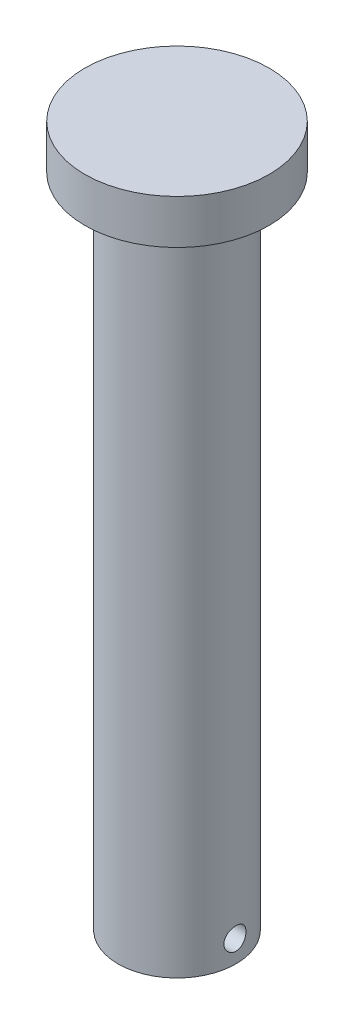
ISO-10303-21;
HEADER;
FILE_DESCRIPTION(('STEP AP214'),'2;1');
FILE_NAME('part.step','',(''),(''),'','','');
FILE_SCHEMA(('AUTOMOTIVE_DESIGN { 1 0 10303 214 1 1 1 1 }'));
ENDSEC;
DATA;
#1=APPLICATION_CONTEXT('core data for automotive mechanical design processes');
#2=APPLICATION_PROTOCOL_DEFINITION('international standard','automotive_design',2000,#1);
#3=PRODUCT_CONTEXT('',#1,'mechanical');
#4=PRODUCT('Part','Part','',(#3));
#5=PRODUCT_RELATED_PRODUCT_CATEGORY('part','',(#4));
#6=PRODUCT_DEFINITION_FORMATION('','',#4);
#7=PRODUCT_DEFINITION_CONTEXT('part definition',#1,'design');
#8=PRODUCT_DEFINITION('design','',#6,#7);
#9=PRODUCT_DEFINITION_SHAPE('','',#8);
#10=(LENGTH_UNIT() NAMED_UNIT(*) SI_UNIT(.MILLI.,.METRE.));
#11=(NAMED_UNIT(*) PLANE_ANGLE_UNIT() SI_UNIT($,.RADIAN.));
#12=(NAMED_UNIT(*) SI_UNIT($,.STERADIAN.) SOLID_ANGLE_UNIT());
#13=UNCERTAINTY_MEASURE_WITH_UNIT(LENGTH_MEASURE(1.E-05),#10,'distance_accuracy_value','');
#14=(GEOMETRIC_REPRESENTATION_CONTEXT(3) GLOBAL_UNCERTAINTY_ASSIGNED_CONTEXT((#13)) GLOBAL_UNIT_ASSIGNED_CONTEXT((#10,
#11,#12)) REPRESENTATION_CONTEXT('',''));
#15=CARTESIAN_POINT('',(0.,0.,0.));
#16=DIRECTION('',(0.,0.,1.));
#17=DIRECTION('',(1.,0.,0.));
#18=AXIS2_PLACEMENT_3D('',#15,#16,#17);
#19=CARTESIAN_POINT('',(0.,178.,0.));
#20=DIRECTION('',(0.,-1.,0.));
#21=DIRECTION('',(0.,0.,-1.));
#22=AXIS2_PLACEMENT_3D('',#19,#20,#21);
#23=CYLINDRICAL_SURFACE('',#22,16.);
#24=CARTESIAN_POINT('',(0.,178.,0.));
#25=DIRECTION('',(0.,1.,0.));
#26=DIRECTION('',(0.,0.,1.));
#27=AXIS2_PLACEMENT_3D('',#24,#25,#26);
#28=CIRCLE('',#27,16.);
#29=CARTESIAN_POINT('',(0.,178.,16.));
#30=VERTEX_POINT('',#29);
#31=EDGE_CURVE('E10',#30,#30,#28,.T.);
#32=ORIENTED_EDGE('',*,*,#31,.F.);
#33=EDGE_LOOP('',(#32));
#34=FACE_BOUND('',#33,.T.);
#35=CARTESIAN_POINT('',(0.,0.,0.));
#36=DIRECTION('',(0.,1.,0.));
#37=DIRECTION('',(0.,0.,1.));
#38=AXIS2_PLACEMENT_3D('',#35,#36,#37);
#39=CIRCLE('',#38,16.);
#40=CARTESIAN_POINT('',(0.,0.,16.));
#41=VERTEX_POINT('',#40);
#42=EDGE_CURVE('E49',#41,#41,#39,.T.);
#43=ORIENTED_EDGE('',*,*,#42,.T.);
#44=EDGE_LOOP('',(#43));
#45=FACE_BOUND('',#44,.T.);
#46=CARTESIAN_POINT('',(-15.7162336455017,6.00000000000001,2.99999999999998));
#47=CARTESIAN_POINT('',(-15.7162368759014,6.16691441602525,2.99999359766586));
#48=CARTESIAN_POINT('',(-15.7189215952138,6.33391189643726,2.98602252697895));
#49=CARTESIAN_POINT('',(-15.7293570202788,6.66319792316335,2.93054506503582));
#50=CARTESIAN_POINT('',(-15.7371120234618,6.82548235285483,2.88901531536944));
#51=CARTESIAN_POINT('',(-15.7567795293,7.14053014274188,2.7797407123558));
#52=CARTESIAN_POINT('',(-15.7686881581205,7.29330221861462,2.71202027908747));
#53=CARTESIAN_POINT('',(-15.7953165264186,7.58530711857359,2.55235131520727));
#54=CARTESIAN_POINT('',(-15.8100360465123,7.7245409980066,2.46040467518384));
#55=CARTESIAN_POINT('',(-15.8408322967791,7.98726039839828,2.25367357885243));
#56=CARTESIAN_POINT('',(-15.8569223325136,8.11055296694347,2.13864585866181));
#57=CARTESIAN_POINT('',(-15.8885291532806,8.33620877919913,1.88954355760708));
#58=CARTESIAN_POINT('',(-15.904045900623,8.43857064884959,1.75546772724986));
#59=CARTESIAN_POINT('',(-15.9329003565681,8.62019875320104,1.4708077891403));
#60=CARTESIAN_POINT('',(-15.9462205610473,8.69928306703885,1.32010568006771));
#61=CARTESIAN_POINT('',(-15.9690321726586,8.83093908454707,1.0072625665015));
#62=CARTESIAN_POINT('',(-15.9785238945667,8.88351296798045,0.845122503718987));
#63=CARTESIAN_POINT('',(-15.9925151024756,8.96005909722227,0.516005492374808));
#64=CARTESIAN_POINT('',(-15.9970713195265,8.98435661184538,0.34910664648969));
#65=CARTESIAN_POINT('',(-16.0008736923119,9.00467377540081,0.0135433520707431));
#66=CARTESIAN_POINT('',(-16.0001203002139,9.00069583227812,-0.155120944895363));
#67=CARTESIAN_POINT('',(-15.9934326752648,8.9648244577057,-0.487196715798817));
#68=CARTESIAN_POINT('',(-15.9875634449443,8.93328126113998,-0.650647520902962));
#69=CARTESIAN_POINT('',(-15.9713765266712,8.84372870120953,-0.969894331430974));
#70=CARTESIAN_POINT('',(-15.9610586765993,8.7857183733084,-1.1256900576531));
#71=CARTESIAN_POINT('',(-15.9370252059468,8.6445445378834,-1.42622013150307));
#72=CARTESIAN_POINT('',(-15.9232907518165,8.56124102417501,-1.57088714367709));
#73=CARTESIAN_POINT('',(-15.893942950857,8.3719486618457,-1.8443199544293));
#74=CARTESIAN_POINT('',(-15.8783294130233,8.26595750622484,-1.97308413382159));
#75=CARTESIAN_POINT('',(-15.8466702736113,8.03236859403294,-2.2131312379381));
#76=CARTESIAN_POINT('',(-15.8306217180324,7.90446443219586,-2.32411581514085));
#77=CARTESIAN_POINT('',(-15.8001301784924,7.63170093744275,-2.52310343702523));
#78=CARTESIAN_POINT('',(-15.785687218027,7.48684135647073,-2.61110614542366));
#79=CARTESIAN_POINT('',(-15.7600378661424,7.18388345859468,-2.76171704448957));
#80=CARTESIAN_POINT('',(-15.7488370106052,7.02576308561872,-2.82428187290845));
#81=CARTESIAN_POINT('',(-15.7310248479338,6.7009976317536,-2.92187313950114));
#82=CARTESIAN_POINT('',(-15.7244130207724,6.53435351907044,-2.95690269802218));
#83=CARTESIAN_POINT('',(-15.7166304060201,6.19996134228825,-2.9979934529948));
#84=CARTESIAN_POINT('',(-15.7153791163227,6.03226776886897,-3.0044832857172));
#85=CARTESIAN_POINT('',(-15.7182438284168,5.69819308982571,-2.98945937763451));
#86=CARTESIAN_POINT('',(-15.7223595647722,5.53181191970384,-2.96794702172868));
#87=CARTESIAN_POINT('',(-15.7354196012641,5.20649419389123,-2.89789736391767));
#88=CARTESIAN_POINT('',(-15.7443237338176,5.04750749475021,-2.84958477167981));
#89=CARTESIAN_POINT('',(-15.7659226831324,4.73988562053969,-2.72754448758122));
#90=CARTESIAN_POINT('',(-15.7786177792656,4.59125120936934,-2.65381492257592));
#91=CARTESIAN_POINT('',(-15.8065515572737,4.30666476191367,-2.48204706239322));
#92=CARTESIAN_POINT('',(-15.8218179085063,4.17087892426786,-2.38373799279244));
#93=CARTESIAN_POINT('',(-15.853096227362,3.91757591957134,-2.16596688688495));
#94=CARTESIAN_POINT('',(-15.8691082619299,3.80006039688846,-2.04650294866169));
#95=CARTESIAN_POINT('',(-15.9003324801189,3.58503247293175,-1.78789883574079));
#96=CARTESIAN_POINT('',(-15.9155311166661,3.48780834678807,-1.6485170681918));
#97=CARTESIAN_POINT('',(-15.943188096207,3.31815758764468,-1.3551490460803));
#98=CARTESIAN_POINT('',(-15.9556465446945,3.24572999995,-1.20116335407708));
#99=CARTESIAN_POINT('',(-15.9763611599169,3.12815980427184,-0.88375508315739));
#100=CARTESIAN_POINT('',(-15.9846390946028,3.08287562487718,-0.720386426157998));
#101=CARTESIAN_POINT('',(-15.9961528416749,3.02042590342024,-0.38819245476316));
#102=CARTESIAN_POINT('',(-15.9993891845988,3.0032574026746,-0.219367716431717));
#103=CARTESIAN_POINT('',(-16.0004445503087,2.99762939696311,0.116181520500992));
#104=CARTESIAN_POINT('',(-15.9983457325,3.00873449374091,0.282898614132494));
#105=CARTESIAN_POINT('',(-15.9891373322347,3.05838485553692,0.612046738558401));
#106=CARTESIAN_POINT('',(-15.9820277978158,3.09692985748858,0.774477810427441));
#107=CARTESIAN_POINT('',(-15.9635967595586,3.20018241476728,1.09021295119087));
#108=CARTESIAN_POINT('',(-15.9522827196229,3.26484362576144,1.24353263863612));
#109=CARTESIAN_POINT('',(-15.9266674413841,3.41844090731095,1.53721126263368));
#110=CARTESIAN_POINT('',(-15.912366002962,3.50737860421547,1.67756933000767));
#111=CARTESIAN_POINT('',(-15.882095597166,3.70850290888246,1.94351005555882));
#112=CARTESIAN_POINT('',(-15.8661056917023,3.82100406771521,2.06885247077665));
#113=CARTESIAN_POINT('',(-15.8343926708998,4.06540912499363,2.29903072131407));
#114=CARTESIAN_POINT('',(-15.8186696191953,4.19731758077809,2.40386172651198));
#115=CARTESIAN_POINT('',(-15.7891115480538,4.47825290938014,2.59095267889403));
#116=CARTESIAN_POINT('',(-15.7752953438736,4.6274268792286,2.67299481058045));
#117=CARTESIAN_POINT('',(-15.7513416912985,4.9376515798521,2.81072264841149));
#118=CARTESIAN_POINT('',(-15.7412007725928,5.09869093315073,2.8664332327646));
#119=CARTESIAN_POINT('',(-15.7278603261272,5.38350457614774,2.93859453193227));
#120=CARTESIAN_POINT('',(-15.7235262144357,5.5056114475282,2.96158211479936));
#121=CARTESIAN_POINT('',(-15.7177117118331,5.75179693683634,2.9922870215219));
#122=CARTESIAN_POINT('',(-15.7162312432422,5.87587550099935,3.00000476104179));
#123=CARTESIAN_POINT('',(-15.7162336455017,6.00000000000001,2.99999999999998));
#124=B_SPLINE_CURVE_WITH_KNOTS('',3,(#46,#47,#48,#49,#50,#51,#52,#53,#54,#55,#56,#57,#58,#59,
#60,#61,#62,#63,#64,#65,#66,#67,#68,#69,#70,#71,#72,#73,#74,#75,#76,#77,#78,#79,#80,#81,#82,#83,
#84,#85,#86,#87,#88,#89,#90,#91,#92,#93,#94,#95,#96,#97,#98,#99,#100,#101,#102,#103,#104,#105,
#106,#107,#108,#109,#110,#111,#112,#113,#114,#115,#116,#117,#118,#119,#120,#121,#122,#123),
.UNSPECIFIED.,.T.,.F.,(4,2,2,2,2,2,2,2,2,2,2,2,2,2,2,2,2,2,2,2,2,2,2,2,2,2,2,2,2,2,2,2,2,2,2,2,
2,2,4),(0.,0.500289011586374,1.00100260476079,1.50125045595686,2.00145927987816,
2.50724671397382,3.0130673413863,3.52274208696095,4.03237491879281,4.53608550920522,
5.03975320401296,5.53711301197449,6.03449094656849,6.53467383968438,7.03490761823571,
7.54281229528129,8.050724403848,8.55949872236533,9.06821537732975,9.5692649717415,
10.0702897867744,10.5671758463074,11.0640985324863,11.5667572530829,12.0694611878935,
12.5788825099174,13.0882842164341,13.5950053883737,14.1016732333466,14.6005860114028,
15.0994940064433,15.5975205306072,16.0955804271422,16.6007692801749,17.1060769546153,
17.6160600363781,18.1255603150176,18.4976061505795,18.8696418584437),.UNSPECIFIED.);
#125=CARTESIAN_POINT('',(-15.7162336455017,6.00000000000001,2.99999999999998));
#126=VERTEX_POINT('',#125);
#127=EDGE_CURVE('E59',#126,#126,#124,.T.);
#128=ORIENTED_EDGE('',*,*,#127,.F.);
#129=EDGE_LOOP('',(#128));
#130=FACE_BOUND('',#129,.T.);
#131=CARTESIAN_POINT('',(15.7162336455017,6.00000000000001,2.99999999999998));
#132=CARTESIAN_POINT('',(15.7162368759014,5.83308558397476,2.99999359766586));
#133=CARTESIAN_POINT('',(15.7189215952138,5.66608810356275,2.98602252697895));
#134=CARTESIAN_POINT('',(15.7293570202788,5.33680207683666,2.93054506503582));
#135=CARTESIAN_POINT('',(15.7371120234618,5.17451764714518,2.88901531536944));
#136=CARTESIAN_POINT('',(15.7567795293,4.85946985725813,2.7797407123558));
#137=CARTESIAN_POINT('',(15.7686881581205,4.70669778138539,2.71202027908747));
#138=CARTESIAN_POINT('',(15.7953165264186,4.41469288142641,2.55235131520727));
#139=CARTESIAN_POINT('',(15.8100360465123,4.27545900199341,2.46040467518384));
#140=CARTESIAN_POINT('',(15.8408322967791,4.01273960160173,2.25367357885243));
#141=CARTESIAN_POINT('',(15.8569223325136,3.88944703305654,2.13864585866181));
#142=CARTESIAN_POINT('',(15.8885291532806,3.66379122080088,1.88954355760708));
#143=CARTESIAN_POINT('',(15.904045900623,3.56142935115042,1.75546772724986));
#144=CARTESIAN_POINT('',(15.9329003565681,3.37980124679897,1.4708077891403));
#145=CARTESIAN_POINT('',(15.9462205610473,3.30071693296116,1.32010568006771));
#146=CARTESIAN_POINT('',(15.9690321726586,3.16906091545294,1.0072625665015));
#147=CARTESIAN_POINT('',(15.9785238945667,3.11648703201957,0.845122503718987));
#148=CARTESIAN_POINT('',(15.9925151024756,3.03994090277774,0.516005492374807));
#149=CARTESIAN_POINT('',(15.9970713195265,3.01564338815464,0.34910664648969));
#150=CARTESIAN_POINT('',(16.0008736923119,2.9953262245992,0.0135433520707419));
#151=CARTESIAN_POINT('',(16.0001203002139,2.99930416772189,-0.155120944895364));
#152=CARTESIAN_POINT('',(15.9934326752648,3.03517554229431,-0.487196715798817));
#153=CARTESIAN_POINT('',(15.9875634449443,3.06671873886003,-0.650647520902962));
#154=CARTESIAN_POINT('',(15.9713765266712,3.15627129879048,-0.969894331430974));
#155=CARTESIAN_POINT('',(15.9610586765993,3.21428162669161,-1.1256900576531));
#156=CARTESIAN_POINT('',(15.9370252059468,3.35545546211661,-1.42622013150307));
#157=CARTESIAN_POINT('',(15.9232907518165,3.438758975825,-1.57088714367709));
#158=CARTESIAN_POINT('',(15.893942950857,3.62805133815431,-1.8443199544293));
#159=CARTESIAN_POINT('',(15.8783294130233,3.73404249377517,-1.97308413382159));
#160=CARTESIAN_POINT('',(15.8466702736113,3.96763140596707,-2.2131312379381));
#161=CARTESIAN_POINT('',(15.8306217180324,4.09553556780415,-2.32411581514085));
#162=CARTESIAN_POINT('',(15.8001301784924,4.36829906255726,-2.52310343702523));
#163=CARTESIAN_POINT('',(15.785687218027,4.51315864352928,-2.61110614542367));
#164=CARTESIAN_POINT('',(15.7600378661424,4.81611654140533,-2.76171704448957));
#165=CARTESIAN_POINT('',(15.7488370106052,4.97423691438129,-2.82428187290845));
#166=CARTESIAN_POINT('',(15.7310248479338,5.29900236824641,-2.92187313950114));
#167=CARTESIAN_POINT('',(15.7244130207724,5.46564648092957,-2.95690269802218));
#168=CARTESIAN_POINT('',(15.7166304060201,5.80003865771176,-2.9979934529948));
#169=CARTESIAN_POINT('',(15.7153791163227,5.96773223113104,-3.0044832857172));
#170=CARTESIAN_POINT('',(15.7182438284168,6.3018069101743,-2.98945937763451));
#171=CARTESIAN_POINT('',(15.7223595647722,6.46818808029617,-2.96794702172868));
#172=CARTESIAN_POINT('',(15.7354196012641,6.79350580610878,-2.89789736391767));
#173=CARTESIAN_POINT('',(15.7443237338176,6.9524925052498,-2.84958477167981));
#174=CARTESIAN_POINT('',(15.7659226831324,7.26011437946032,-2.72754448758122));
#175=CARTESIAN_POINT('',(15.7786177792656,7.40874879063067,-2.65381492257592));
#176=CARTESIAN_POINT('',(15.8065515572737,7.69333523808634,-2.48204706239322));
#177=CARTESIAN_POINT('',(15.8218179085063,7.82912107573215,-2.38373799279244));
#178=CARTESIAN_POINT('',(15.853096227362,8.08242408042867,-2.16596688688496));
#179=CARTESIAN_POINT('',(15.8691082619299,8.19993960311155,-2.0465029486617));
#180=CARTESIAN_POINT('',(15.9003324801189,8.41496752706826,-1.78789883574079));
#181=CARTESIAN_POINT('',(15.9155311166661,8.51219165321194,-1.6485170681918));
#182=CARTESIAN_POINT('',(15.943188096207,8.68184241235533,-1.3551490460803));
#183=CARTESIAN_POINT('',(15.9556465446945,8.75427000005002,-1.20116335407708));
#184=CARTESIAN_POINT('',(15.9763611599169,8.87184019572817,-0.883755083157391));
#185=CARTESIAN_POINT('',(15.9846390946028,8.91712437512283,-0.720386426157999));
#186=CARTESIAN_POINT('',(15.9961528416749,8.97957409657977,-0.388192454763162));
#187=CARTESIAN_POINT('',(15.9993891845988,8.99674259732541,-0.219367716431718));
#188=CARTESIAN_POINT('',(16.0004445503087,9.0023706030369,0.11618152050099));
#189=CARTESIAN_POINT('',(15.9983457325,8.9912655062591,0.282898614132493));
#190=CARTESIAN_POINT('',(15.9891373322347,8.94161514446309,0.6120467385584));
#191=CARTESIAN_POINT('',(15.9820277978158,8.90307014251143,0.77447781042744));
#192=CARTESIAN_POINT('',(15.9635967595586,8.79981758523273,1.09021295119086));
#193=CARTESIAN_POINT('',(15.9522827196229,8.73515637423857,1.24353263863612));
#194=CARTESIAN_POINT('',(15.9266674413841,8.58155909268906,1.53721126263368));
#195=CARTESIAN_POINT('',(15.912366002962,8.49262139578454,1.67756933000767));
#196=CARTESIAN_POINT('',(15.882095597166,8.29149709111755,1.94351005555882));
#197=CARTESIAN_POINT('',(15.8661056917023,8.1789959322848,2.06885247077665));
#198=CARTESIAN_POINT('',(15.8343926708998,7.93459087500638,2.29903072131407));
#199=CARTESIAN_POINT('',(15.8186696191953,7.80268241922192,2.40386172651198));
#200=CARTESIAN_POINT('',(15.7891115480538,7.52174709061987,2.59095267889403));
#201=CARTESIAN_POINT('',(15.7752953438736,7.37257312077141,2.67299481058045));
#202=CARTESIAN_POINT('',(15.7513416912985,7.06234842014791,2.81072264841149));
#203=CARTESIAN_POINT('',(15.7412007725928,6.90130906684928,2.8664332327646));
#204=CARTESIAN_POINT('',(15.7278603261272,6.61649542385227,2.93859453193227));
#205=CARTESIAN_POINT('',(15.7235262144357,6.49438855247181,2.96158211479936));
#206=CARTESIAN_POINT('',(15.7177117118331,6.24820306316368,2.9922870215219));
#207=CARTESIAN_POINT('',(15.7162312432422,6.12412449900066,3.00000476104179));
#208=CARTESIAN_POINT('',(15.7162336455017,6.00000000000001,2.99999999999998));
#209=B_SPLINE_CURVE_WITH_KNOTS('',3,(#131,#132,#133,#134,#135,#136,#137,#138,#139,#140,#141,
#142,#143,#144,#145,#146,#147,#148,#149,#150,#151,#152,#153,#154,#155,#156,#157,#158,#159,#160,
#161,#162,#163,#164,#165,#166,#167,#168,#169,#170,#171,#172,#173,#174,#175,#176,#177,#178,#179,
#180,#181,#182,#183,#184,#185,#186,#187,#188,#189,#190,#191,#192,#193,#194,#195,#196,#197,#198,
#199,#200,#201,#202,#203,#204,#205,#206,#207,#208),.UNSPECIFIED.,.T.,.F.,(4,2,2,2,2,2,2,2,2,2,2,
2,2,2,2,2,2,2,2,2,2,2,2,2,2,2,2,2,2,2,2,2,2,2,2,2,2,2,4),(0.,0.500289011586374,1.00100260476079,
1.50125045595687,2.00145927987816,2.50724671397382,3.0130673413863,3.52274208696095,
4.03237491879281,4.53608550920522,5.03975320401296,5.53711301197449,6.03449094656849,
6.53467383968438,7.03490761823571,7.54281229528128,8.050724403848,8.55949872236533,
9.06821537732975,9.5692649717415,10.0702897867744,10.5671758463074,11.0640985324863,
11.5667572530829,12.0694611878935,12.5788825099174,13.0882842164341,13.5950053883737,
14.1016732333466,14.6005860114028,15.0994940064433,15.5975205306072,16.0955804271422,
16.6007692801749,17.1060769546153,17.6160600363782,18.1255603150176,18.4976061505795,
18.8696418584437),.UNSPECIFIED.);
#210=CARTESIAN_POINT('',(15.7162336455017,6.00000000000001,2.99999999999998));
#211=VERTEX_POINT('',#210);
#212=EDGE_CURVE('E41',#211,#211,#209,.T.);
#213=ORIENTED_EDGE('',*,*,#212,.F.);
#214=EDGE_LOOP('',(#213));
#215=FACE_BOUND('',#214,.T.);
#216=ADVANCED_FACE('F37',(#34,#45,#130,#215),#23,.T.);
#217=CARTESIAN_POINT('',(0.,0.,0.));
#218=DIRECTION('',(0.,1.,0.));
#219=DIRECTION('',(0.,0.,1.));
#220=AXIS2_PLACEMENT_3D('',#217,#218,#219);
#221=PLANE('',#220);
#222=ORIENTED_EDGE('',*,*,#42,.F.);
#223=EDGE_LOOP('',(#222));
#224=FACE_BOUND('',#223,.T.);
#225=ADVANCED_FACE('F79',(#224),#221,.F.);
#226=CARTESIAN_POINT('',(0.,190.,0.));
#227=DIRECTION('',(0.,-1.,0.));
#228=DIRECTION('',(0.,0.,-1.));
#229=AXIS2_PLACEMENT_3D('',#226,#227,#228);
#230=CYLINDRICAL_SURFACE('',#229,25.);
#231=CARTESIAN_POINT('',(0.,190.,0.));
#232=DIRECTION('',(0.,1.,0.));
#233=DIRECTION('',(0.,0.,1.));
#234=AXIS2_PLACEMENT_3D('',#231,#232,#233);
#235=CIRCLE('',#234,25.);
#236=CARTESIAN_POINT('',(0.,190.,25.));
#237=VERTEX_POINT('',#236);
#238=EDGE_CURVE('E54',#237,#237,#235,.T.);
#239=ORIENTED_EDGE('',*,*,#238,.F.);
#240=EDGE_LOOP('',(#239));
#241=FACE_BOUND('',#240,.T.);
#242=CARTESIAN_POINT('',(0.,178.,0.));
#243=DIRECTION('',(0.,1.,0.));
#244=DIRECTION('',(0.,0.,1.));
#245=AXIS2_PLACEMENT_3D('',#242,#243,#244);
#246=CIRCLE('',#245,25.);
#247=CARTESIAN_POINT('',(0.,178.,25.));
#248=VERTEX_POINT('',#247);
#249=EDGE_CURVE('E57',#248,#248,#246,.T.);
#250=ORIENTED_EDGE('',*,*,#249,.T.);
#251=EDGE_LOOP('',(#250));
#252=FACE_BOUND('',#251,.T.);
#253=ADVANCED_FACE('F74',(#241,#252),#230,.T.);
#254=CARTESIAN_POINT('',(0.,190.,0.));
#255=DIRECTION('',(0.,1.,0.));
#256=DIRECTION('',(0.,0.,1.));
#257=AXIS2_PLACEMENT_3D('',#254,#255,#256);
#258=PLANE('',#257);
#259=ORIENTED_EDGE('',*,*,#238,.T.);
#260=EDGE_LOOP('',(#259));
#261=FACE_BOUND('',#260,.T.);
#262=ADVANCED_FACE('F70',(#261),#258,.T.);
#263=CARTESIAN_POINT('',(0.,178.,0.));
#264=DIRECTION('',(0.,1.,0.));
#265=DIRECTION('',(0.,0.,1.));
#266=AXIS2_PLACEMENT_3D('',#263,#264,#265);
#267=PLANE('',#266);
#268=ORIENTED_EDGE('',*,*,#31,.T.);
#269=EDGE_LOOP('',(#268));
#270=FACE_BOUND('',#269,.T.);
#271=ORIENTED_EDGE('',*,*,#249,.F.);
#272=EDGE_LOOP('',(#271));
#273=FACE_BOUND('',#272,.T.);
#274=ADVANCED_FACE('F68',(#270,#273),#267,.F.);
#275=CARTESIAN_POINT('',(25.,6.00000000000001,0.));
#276=DIRECTION('',(-1.,0.,0.));
#277=DIRECTION('',(0.,0.,1.));
#278=AXIS2_PLACEMENT_3D('',#275,#276,#277);
#279=CYLINDRICAL_SURFACE('',#278,3.);
#280=ORIENTED_EDGE('',*,*,#127,.T.);
#281=EDGE_LOOP('',(#280));
#282=FACE_BOUND('',#281,.T.);
#283=ORIENTED_EDGE('',*,*,#212,.T.);
#284=EDGE_LOOP('',(#283));
#285=FACE_BOUND('',#284,.T.);
#286=ADVANCED_FACE('F64',(#282,#285),#279,.F.);
#287=CLOSED_SHELL('',(#216,#225,#253,#262,#274,#286));
#288=MANIFOLD_SOLID_BREP('B2',#287);
#289=ADVANCED_BREP_SHAPE_REPRESENTATION('',(#18,#288),#14);
#290=SHAPE_DEFINITION_REPRESENTATION(#9,#289);
ENDSEC;
END-ISO-10303-21;
